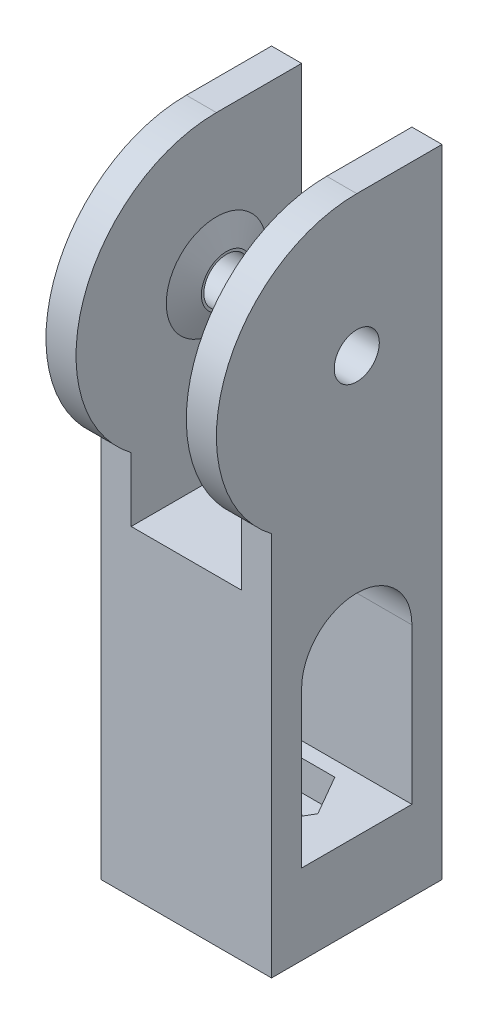
ISO-10303-21;
HEADER;
FILE_DESCRIPTION(('STEP AP214'),'2;1');
FILE_NAME('part.step','',(''),(''),'','','');
FILE_SCHEMA(('AUTOMOTIVE_DESIGN { 1 0 10303 214 1 1 1 1 }'));
ENDSEC;
DATA;
#1=APPLICATION_CONTEXT('core data for automotive mechanical design processes');
#2=APPLICATION_PROTOCOL_DEFINITION('international standard','automotive_design',2000,#1);
#3=PRODUCT_CONTEXT('',#1,'mechanical');
#4=PRODUCT('Part','Part','',(#3));
#5=PRODUCT_RELATED_PRODUCT_CATEGORY('part','',(#4));
#6=PRODUCT_DEFINITION_FORMATION('','',#4);
#7=PRODUCT_DEFINITION_CONTEXT('part definition',#1,'design');
#8=PRODUCT_DEFINITION('design','',#6,#7);
#9=PRODUCT_DEFINITION_SHAPE('','',#8);
#10=(LENGTH_UNIT() NAMED_UNIT(*) SI_UNIT(.MILLI.,.METRE.));
#11=(NAMED_UNIT(*) PLANE_ANGLE_UNIT() SI_UNIT($,.RADIAN.));
#12=(NAMED_UNIT(*) SI_UNIT($,.STERADIAN.) SOLID_ANGLE_UNIT());
#13=UNCERTAINTY_MEASURE_WITH_UNIT(LENGTH_MEASURE(1.E-05),#10,'distance_accuracy_value','');
#14=(GEOMETRIC_REPRESENTATION_CONTEXT(3) GLOBAL_UNCERTAINTY_ASSIGNED_CONTEXT((#13)) GLOBAL_UNIT_ASSIGNED_CONTEXT((#10,
#11,#12)) REPRESENTATION_CONTEXT('',''));
#15=CARTESIAN_POINT('',(0.,0.,0.));
#16=DIRECTION('',(0.,0.,1.));
#17=DIRECTION('',(1.,0.,0.));
#18=AXIS2_PLACEMENT_3D('',#15,#16,#17);
#19=CARTESIAN_POINT('',(8.5,14.5053823869162,8.5));
#20=DIRECTION('',(0.,-1.,0.));
#21=DIRECTION('',(0.,0.,-1.));
#22=AXIS2_PLACEMENT_3D('',#19,#20,#21);
#23=CYLINDRICAL_SURFACE('',#22,2.3);
#24=CARTESIAN_POINT('',(8.5,0.,8.5));
#25=DIRECTION('',(0.,-1.,0.));
#26=DIRECTION('',(0.,0.,-1.));
#27=AXIS2_PLACEMENT_3D('',#24,#25,#26);
#28=CIRCLE('',#27,2.3);
#29=CARTESIAN_POINT('',(8.5,0.,6.2));
#30=VERTEX_POINT('',#29);
#31=EDGE_CURVE('E259',#30,#30,#28,.T.);
#32=ORIENTED_EDGE('',*,*,#31,.T.);
#33=EDGE_LOOP('',(#32));
#34=FACE_BOUND('',#33,.T.);
#35=CARTESIAN_POINT('',(8.5,5.,8.5));
#36=DIRECTION('',(0.,1.,0.));
#37=DIRECTION('',(-1.,0.,0.));
#38=AXIS2_PLACEMENT_3D('',#35,#36,#37);
#39=CIRCLE('',#38,2.3);
#40=CARTESIAN_POINT('',(6.2,5.,8.5));
#41=VERTEX_POINT('',#40);
#42=EDGE_CURVE('E251',#41,#41,#39,.F.);
#43=ORIENTED_EDGE('',*,*,#42,.F.);
#44=EDGE_LOOP('',(#43));
#45=FACE_BOUND('',#44,.T.);
#46=ADVANCED_FACE('F60',(#34,#45),#23,.F.);
#47=CARTESIAN_POINT('',(0.,0.,22.5));
#48=DIRECTION('',(1.,0.,0.));
#49=DIRECTION('',(0.,0.,-1.));
#50=AXIS2_PLACEMENT_3D('',#47,#48,#49);
#51=PLANE('',#50);
#52=CARTESIAN_POINT('',(0.,49.5,8.5));
#53=DIRECTION('',(1.,0.,0.));
#54=DIRECTION('',(0.,0.,-1.));
#55=AXIS2_PLACEMENT_3D('',#52,#53,#54);
#56=CIRCLE('',#55,2.25);
#57=CARTESIAN_POINT('',(0.,49.5,6.25000000000001));
#58=VERTEX_POINT('',#57);
#59=EDGE_CURVE('E773',#58,#58,#56,.T.);
#60=ORIENTED_EDGE('',*,*,#59,.T.);
#61=EDGE_LOOP('',(#60));
#62=FACE_BOUND('',#61,.T.);
#63=CARTESIAN_POINT('',(0.,49.5,8.5));
#64=DIRECTION('',(1.,0.,0.));
#65=DIRECTION('',(0.,0.,-1.));
#66=AXIS2_PLACEMENT_3D('',#63,#64,#65);
#67=CIRCLE('',#66,14.);
#68=CARTESIAN_POINT('',(0.,63.5,8.5));
#69=VERTEX_POINT('',#68);
#70=CARTESIAN_POINT('',(0.,38.3757022693565,17.));
#71=VERTEX_POINT('',#70);
#72=EDGE_CURVE('E297',#69,#71,#67,.T.);
#73=ORIENTED_EDGE('',*,*,#72,.F.);
#74=DIRECTION('',(0.,0.,-1.));
#75=VECTOR('',#74,1.);
#76=CARTESIAN_POINT('',(0.,63.5,22.5));
#77=LINE('',#76,#75);
#78=CARTESIAN_POINT('',(0.,63.5,0.));
#79=VERTEX_POINT('',#78);
#80=EDGE_CURVE('E344',#69,#79,#77,.T.);
#81=ORIENTED_EDGE('',*,*,#80,.T.);
#82=DIRECTION('',(0.,-1.,0.));
#83=VECTOR('',#82,1.);
#84=CARTESIAN_POINT('',(0.,0.,0.));
#85=LINE('',#84,#83);
#86=CARTESIAN_POINT('',(0.,0.,0.));
#87=VERTEX_POINT('',#86);
#88=EDGE_CURVE('E320',#79,#87,#85,.T.);
#89=ORIENTED_EDGE('',*,*,#88,.T.);
#90=DIRECTION('',(0.,0.,-1.));
#91=VECTOR('',#90,1.);
#92=CARTESIAN_POINT('',(0.,0.,22.5));
#93=LINE('',#92,#91);
#94=CARTESIAN_POINT('',(0.,0.,17.));
#95=VERTEX_POINT('',#94);
#96=EDGE_CURVE('E69',#95,#87,#93,.T.);
#97=ORIENTED_EDGE('',*,*,#96,.F.);
#98=DIRECTION('',(0.,-1.,0.));
#99=VECTOR('',#98,1.);
#100=CARTESIAN_POINT('',(0.,0.,17.));
#101=LINE('',#100,#99);
#102=EDGE_CURVE('E299',#71,#95,#101,.T.);
#103=ORIENTED_EDGE('',*,*,#102,.F.);
#104=EDGE_LOOP('',(#73,#81,#89,#97,#103));
#105=FACE_BOUND('',#104,.T.);
#106=CARTESIAN_POINT('',(0.,23.5,8.5));
#107=DIRECTION('',(1.,0.,0.));
#108=DIRECTION('',(0.,0.,-1.));
#109=AXIS2_PLACEMENT_3D('',#106,#107,#108);
#110=CIRCLE('',#109,5.5);
#111=CARTESIAN_POINT('',(0.,23.5,14.));
#112=VERTEX_POINT('',#111);
#113=CARTESIAN_POINT('',(0.,23.5,3.));
#114=VERTEX_POINT('',#113);
#115=EDGE_CURVE('E269',#112,#114,#110,.F.);
#116=ORIENTED_EDGE('',*,*,#115,.F.);
#117=DIRECTION('',(0.,-1.,0.));
#118=VECTOR('',#117,1.);
#119=CARTESIAN_POINT('',(0.,0.,14.));
#120=LINE('',#119,#118);
#121=CARTESIAN_POINT('',(0.,8.,14.));
#122=VERTEX_POINT('',#121);
#123=EDGE_CURVE('E270',#112,#122,#120,.T.);
#124=ORIENTED_EDGE('',*,*,#123,.T.);
#125=DIRECTION('',(0.,0.,-1.));
#126=VECTOR('',#125,1.);
#127=CARTESIAN_POINT('',(0.,8.,0.));
#128=LINE('',#127,#126);
#129=CARTESIAN_POINT('',(0.,8.,3.));
#130=VERTEX_POINT('',#129);
#131=EDGE_CURVE('E85',#122,#130,#128,.T.);
#132=ORIENTED_EDGE('',*,*,#131,.T.);
#133=DIRECTION('',(0.,-1.,0.));
#134=VECTOR('',#133,1.);
#135=CARTESIAN_POINT('',(0.,0.,3.));
#136=LINE('',#135,#134);
#137=EDGE_CURVE('E285',#114,#130,#136,.T.);
#138=ORIENTED_EDGE('',*,*,#137,.F.);
#139=EDGE_LOOP('',(#116,#124,#132,#138));
#140=FACE_BOUND('',#139,.T.);
#141=ADVANCED_FACE('F62',(#62,#105,#140),#51,.F.);
#142=CARTESIAN_POINT('',(17.,0.,22.5));
#143=DIRECTION('',(-1.,0.,0.));
#144=DIRECTION('',(0.,0.,1.));
#145=AXIS2_PLACEMENT_3D('',#142,#143,#144);
#146=PLANE('',#145);
#147=CARTESIAN_POINT('',(17.,49.5,8.5));
#148=DIRECTION('',(1.,0.,0.));
#149=DIRECTION('',(0.,0.,-1.));
#150=AXIS2_PLACEMENT_3D('',#147,#148,#149);
#151=CIRCLE('',#150,2.25);
#152=CARTESIAN_POINT('',(17.,49.5,6.25));
#153=VERTEX_POINT('',#152);
#154=EDGE_CURVE('E777',#153,#153,#151,.T.);
#155=ORIENTED_EDGE('',*,*,#154,.F.);
#156=EDGE_LOOP('',(#155));
#157=FACE_BOUND('',#156,.T.);
#158=DIRECTION('',(0.,0.,-1.));
#159=VECTOR('',#158,1.);
#160=CARTESIAN_POINT('',(17.,63.5,22.5));
#161=LINE('',#160,#159);
#162=CARTESIAN_POINT('',(17.,63.5,8.5));
#163=VERTEX_POINT('',#162);
#164=CARTESIAN_POINT('',(17.,63.5,0.));
#165=VERTEX_POINT('',#164);
#166=EDGE_CURVE('E354',#163,#165,#161,.T.);
#167=ORIENTED_EDGE('',*,*,#166,.F.);
#168=CARTESIAN_POINT('',(17.,49.5,8.5));
#169=DIRECTION('',(1.,0.,0.));
#170=DIRECTION('',(0.,0.,-1.));
#171=AXIS2_PLACEMENT_3D('',#168,#169,#170);
#172=CIRCLE('',#171,14.);
#173=CARTESIAN_POINT('',(17.,38.3757022693565,17.));
#174=VERTEX_POINT('',#173);
#175=EDGE_CURVE('E296',#163,#174,#172,.T.);
#176=ORIENTED_EDGE('',*,*,#175,.T.);
#177=DIRECTION('',(0.,-1.,0.));
#178=VECTOR('',#177,1.);
#179=CARTESIAN_POINT('',(17.,0.,17.));
#180=LINE('',#179,#178);
#181=CARTESIAN_POINT('',(17.,0.,17.));
#182=VERTEX_POINT('',#181);
#183=EDGE_CURVE('E300',#174,#182,#180,.T.);
#184=ORIENTED_EDGE('',*,*,#183,.T.);
#185=DIRECTION('',(0.,0.,-1.));
#186=VECTOR('',#185,1.);
#187=CARTESIAN_POINT('',(17.,0.,22.5));
#188=LINE('',#187,#186);
#189=CARTESIAN_POINT('',(17.,0.,0.));
#190=VERTEX_POINT('',#189);
#191=EDGE_CURVE('E356',#182,#190,#188,.T.);
#192=ORIENTED_EDGE('',*,*,#191,.T.);
#193=DIRECTION('',(0.,1.,0.));
#194=VECTOR('',#193,1.);
#195=CARTESIAN_POINT('',(17.,0.,0.));
#196=LINE('',#195,#194);
#197=EDGE_CURVE('E326',#190,#165,#196,.T.);
#198=ORIENTED_EDGE('',*,*,#197,.T.);
#199=EDGE_LOOP('',(#167,#176,#184,#192,#198));
#200=FACE_BOUND('',#199,.T.);
#201=CARTESIAN_POINT('',(17.,23.5,8.5));
#202=DIRECTION('',(1.,0.,0.));
#203=DIRECTION('',(0.,0.,-1.));
#204=AXIS2_PLACEMENT_3D('',#201,#202,#203);
#205=CIRCLE('',#204,5.5);
#206=CARTESIAN_POINT('',(17.,23.5,14.));
#207=VERTEX_POINT('',#206);
#208=CARTESIAN_POINT('',(17.,23.5,3.));
#209=VERTEX_POINT('',#208);
#210=EDGE_CURVE('E262',#207,#209,#205,.F.);
#211=ORIENTED_EDGE('',*,*,#210,.T.);
#212=DIRECTION('',(0.,-1.,0.));
#213=VECTOR('',#212,1.);
#214=CARTESIAN_POINT('',(17.,0.,3.));
#215=LINE('',#214,#213);
#216=CARTESIAN_POINT('',(17.,8.,3.));
#217=VERTEX_POINT('',#216);
#218=EDGE_CURVE('E266',#209,#217,#215,.T.);
#219=ORIENTED_EDGE('',*,*,#218,.T.);
#220=DIRECTION('',(0.,0.,-1.));
#221=VECTOR('',#220,1.);
#222=CARTESIAN_POINT('',(17.,8.,0.));
#223=LINE('',#222,#221);
#224=CARTESIAN_POINT('',(17.,8.,14.));
#225=VERTEX_POINT('',#224);
#226=EDGE_CURVE('E278',#225,#217,#223,.T.);
#227=ORIENTED_EDGE('',*,*,#226,.F.);
#228=DIRECTION('',(0.,-1.,0.));
#229=VECTOR('',#228,1.);
#230=CARTESIAN_POINT('',(17.,0.,14.));
#231=LINE('',#230,#229);
#232=EDGE_CURVE('E282',#207,#225,#231,.T.);
#233=ORIENTED_EDGE('',*,*,#232,.F.);
#234=EDGE_LOOP('',(#211,#219,#227,#233));
#235=FACE_BOUND('',#234,.T.);
#236=ADVANCED_FACE('F389',(#157,#200,#235),#146,.F.);
#237=CARTESIAN_POINT('',(14.,63.5,22.5));
#238=DIRECTION('',(1.,0.,0.));
#239=DIRECTION('',(0.,1.,0.));
#240=AXIS2_PLACEMENT_3D('',#237,#238,#239);
#241=PLANE('',#240);
#242=CARTESIAN_POINT('',(14.,49.5,8.5));
#243=DIRECTION('',(-1.,0.,0.));
#244=DIRECTION('',(0.,-1.,0.));
#245=AXIS2_PLACEMENT_3D('',#242,#243,#244);
#246=CIRCLE('',#245,5.);
#247=CARTESIAN_POINT('',(14.,44.5,8.5));
#248=VERTEX_POINT('',#247);
#249=EDGE_CURVE('E740',#248,#248,#246,.T.);
#250=ORIENTED_EDGE('',*,*,#249,.F.);
#251=EDGE_LOOP('',(#250));
#252=FACE_BOUND('',#251,.T.);
#253=CARTESIAN_POINT('',(14.,49.5,8.5));
#254=DIRECTION('',(1.,0.,0.));
#255=DIRECTION('',(0.,1.,0.));
#256=AXIS2_PLACEMENT_3D('',#253,#254,#255);
#257=CIRCLE('',#256,14.);
#258=CARTESIAN_POINT('',(14.,63.5,8.5));
#259=VERTEX_POINT('',#258);
#260=CARTESIAN_POINT('',(14.,38.3757022693565,17.));
#261=VERTEX_POINT('',#260);
#262=EDGE_CURVE('E314',#259,#261,#257,.T.);
#263=ORIENTED_EDGE('',*,*,#262,.F.);
#264=DIRECTION('',(0.,0.,-1.));
#265=VECTOR('',#264,1.);
#266=CARTESIAN_POINT('',(14.,63.5,22.5));
#267=LINE('',#266,#265);
#268=CARTESIAN_POINT('',(14.,63.5,0.));
#269=VERTEX_POINT('',#268);
#270=EDGE_CURVE('E352',#259,#269,#267,.T.);
#271=ORIENTED_EDGE('',*,*,#270,.T.);
#272=DIRECTION('',(0.,-1.,0.));
#273=VECTOR('',#272,1.);
#274=CARTESIAN_POINT('',(14.,63.5,0.));
#275=LINE('',#274,#273);
#276=CARTESIAN_POINT('',(14.,32.,0.));
#277=VERTEX_POINT('',#276);
#278=EDGE_CURVE('E332',#269,#277,#275,.T.);
#279=ORIENTED_EDGE('',*,*,#278,.T.);
#280=DIRECTION('',(0.,0.,-1.));
#281=VECTOR('',#280,1.);
#282=CARTESIAN_POINT('',(14.,32.,22.5));
#283=LINE('',#282,#281);
#284=CARTESIAN_POINT('',(14.,32.,17.));
#285=VERTEX_POINT('',#284);
#286=EDGE_CURVE('E350',#285,#277,#283,.T.);
#287=ORIENTED_EDGE('',*,*,#286,.F.);
#288=DIRECTION('',(0.,-1.,0.));
#289=VECTOR('',#288,1.);
#290=CARTESIAN_POINT('',(14.,63.5,17.));
#291=LINE('',#290,#289);
#292=EDGE_CURVE('E318',#261,#285,#291,.T.);
#293=ORIENTED_EDGE('',*,*,#292,.F.);
#294=EDGE_LOOP('',(#263,#271,#279,#287,#293));
#295=FACE_BOUND('',#294,.T.);
#296=ADVANCED_FACE('F379',(#252,#295),#241,.F.);
#297=CARTESIAN_POINT('',(2.99999999999999,63.5,22.5));
#298=DIRECTION('',(-1.,0.,0.));
#299=DIRECTION('',(0.,-1.,0.));
#300=AXIS2_PLACEMENT_3D('',#297,#298,#299);
#301=PLANE('',#300);
#302=CARTESIAN_POINT('',(3.,49.5,8.5));
#303=DIRECTION('',(-1.,0.,0.));
#304=DIRECTION('',(0.,-1.,0.));
#305=AXIS2_PLACEMENT_3D('',#302,#303,#304);
#306=CIRCLE('',#305,5.);
#307=CARTESIAN_POINT('',(3.,44.5,8.5));
#308=VERTEX_POINT('',#307);
#309=EDGE_CURVE('E364',#308,#308,#306,.T.);
#310=ORIENTED_EDGE('',*,*,#309,.T.);
#311=EDGE_LOOP('',(#310));
#312=FACE_BOUND('',#311,.T.);
#313=DIRECTION('',(0.,0.,-1.));
#314=VECTOR('',#313,1.);
#315=CARTESIAN_POINT('',(2.99999999999999,63.5,22.5));
#316=LINE('',#315,#314);
#317=CARTESIAN_POINT('',(2.99999999999999,63.5,8.5));
#318=VERTEX_POINT('',#317);
#319=CARTESIAN_POINT('',(2.99999999999999,63.5,0.));
#320=VERTEX_POINT('',#319);
#321=EDGE_CURVE('E346',#318,#320,#316,.T.);
#322=ORIENTED_EDGE('',*,*,#321,.F.);
#323=CARTESIAN_POINT('',(3.,49.5,8.5));
#324=DIRECTION('',(-1.,0.,0.));
#325=DIRECTION('',(0.,-1.,0.));
#326=AXIS2_PLACEMENT_3D('',#323,#324,#325);
#327=CIRCLE('',#326,14.);
#328=CARTESIAN_POINT('',(3.,38.3757022693565,17.));
#329=VERTEX_POINT('',#328);
#330=EDGE_CURVE('E310',#329,#318,#327,.T.);
#331=ORIENTED_EDGE('',*,*,#330,.F.);
#332=DIRECTION('',(0.,1.,0.));
#333=VECTOR('',#332,1.);
#334=CARTESIAN_POINT('',(2.99999999999999,63.5,17.));
#335=LINE('',#334,#333);
#336=CARTESIAN_POINT('',(3.,32.,17.));
#337=VERTEX_POINT('',#336);
#338=EDGE_CURVE('E12',#337,#329,#335,.T.);
#339=ORIENTED_EDGE('',*,*,#338,.F.);
#340=DIRECTION('',(0.,0.,-1.));
#341=VECTOR('',#340,1.);
#342=CARTESIAN_POINT('',(3.,32.,22.5));
#343=LINE('',#342,#341);
#344=CARTESIAN_POINT('',(3.,32.,0.));
#345=VERTEX_POINT('',#344);
#346=EDGE_CURVE('E348',#337,#345,#343,.T.);
#347=ORIENTED_EDGE('',*,*,#346,.T.);
#348=DIRECTION('',(0.,1.,0.));
#349=VECTOR('',#348,1.);
#350=CARTESIAN_POINT('',(2.99999999999999,63.5,0.));
#351=LINE('',#350,#349);
#352=EDGE_CURVE('E338',#345,#320,#351,.T.);
#353=ORIENTED_EDGE('',*,*,#352,.T.);
#354=EDGE_LOOP('',(#322,#331,#339,#347,#353));
#355=FACE_BOUND('',#354,.T.);
#356=ADVANCED_FACE('F368',(#312,#355),#301,.F.);
#357=CARTESIAN_POINT('',(0.,0.,22.5));
#358=DIRECTION('',(0.,1.,0.));
#359=DIRECTION('',(0.,0.,1.));
#360=AXIS2_PLACEMENT_3D('',#357,#358,#359);
#361=PLANE('',#360);
#362=ORIENTED_EDGE('',*,*,#31,.F.);
#363=EDGE_LOOP('',(#362));
#364=FACE_BOUND('',#363,.T.);
#365=DIRECTION('',(1.,0.,0.));
#366=VECTOR('',#365,1.);
#367=CARTESIAN_POINT('',(0.,0.,17.));
#368=LINE('',#367,#366);
#369=EDGE_CURVE('E302',#95,#182,#368,.T.);
#370=ORIENTED_EDGE('',*,*,#369,.F.);
#371=ORIENTED_EDGE('',*,*,#96,.T.);
#372=DIRECTION('',(1.,0.,0.));
#373=VECTOR('',#372,1.);
#374=CARTESIAN_POINT('',(0.,0.,0.));
#375=LINE('',#374,#373);
#376=EDGE_CURVE('E323',#87,#190,#375,.T.);
#377=ORIENTED_EDGE('',*,*,#376,.T.);
#378=ORIENTED_EDGE('',*,*,#191,.F.);
#379=EDGE_LOOP('',(#370,#371,#377,#378));
#380=FACE_BOUND('',#379,.T.);
#381=ADVANCED_FACE('F378',(#364,#380),#361,.F.);
#382=CARTESIAN_POINT('',(3.,32.,22.5));
#383=DIRECTION('',(0.,-1.,0.));
#384=DIRECTION('',(0.,0.,-1.));
#385=AXIS2_PLACEMENT_3D('',#382,#383,#384);
#386=PLANE('',#385);
#387=DIRECTION('',(-1.,0.,0.));
#388=VECTOR('',#387,1.);
#389=CARTESIAN_POINT('',(3.,32.,17.));
#390=LINE('',#389,#388);
#391=EDGE_CURVE('E316',#285,#337,#390,.T.);
#392=ORIENTED_EDGE('',*,*,#391,.F.);
#393=ORIENTED_EDGE('',*,*,#286,.T.);
#394=DIRECTION('',(-1.,0.,0.));
#395=VECTOR('',#394,1.);
#396=CARTESIAN_POINT('',(3.,32.,0.));
#397=LINE('',#396,#395);
#398=EDGE_CURVE('E335',#277,#345,#397,.T.);
#399=ORIENTED_EDGE('',*,*,#398,.T.);
#400=ORIENTED_EDGE('',*,*,#346,.F.);
#401=EDGE_LOOP('',(#392,#393,#399,#400));
#402=FACE_BOUND('',#401,.T.);
#403=ADVANCED_FACE('F382',(#402),#386,.F.);
#404=CARTESIAN_POINT('',(14.,63.5,22.5));
#405=DIRECTION('',(0.,-1.,0.));
#406=DIRECTION('',(0.,0.,-1.));
#407=AXIS2_PLACEMENT_3D('',#404,#405,#406);
#408=PLANE('',#407);
#409=ORIENTED_EDGE('',*,*,#270,.F.);
#410=DIRECTION('',(1.,0.,0.));
#411=VECTOR('',#410,1.);
#412=CARTESIAN_POINT('',(0.,63.5,8.5));
#413=LINE('',#412,#411);
#414=EDGE_CURVE('E281',#259,#163,#413,.T.);
#415=ORIENTED_EDGE('',*,*,#414,.T.);
#416=ORIENTED_EDGE('',*,*,#166,.T.);
#417=DIRECTION('',(-1.,0.,0.));
#418=VECTOR('',#417,1.);
#419=CARTESIAN_POINT('',(14.,63.5,0.));
#420=LINE('',#419,#418);
#421=EDGE_CURVE('E329',#165,#269,#420,.T.);
#422=ORIENTED_EDGE('',*,*,#421,.T.);
#423=EDGE_LOOP('',(#409,#415,#416,#422));
#424=FACE_BOUND('',#423,.T.);
#425=ADVANCED_FACE('F385',(#424),#408,.F.);
#426=CARTESIAN_POINT('',(0.,63.5,22.5));
#427=DIRECTION('',(0.,-1.,0.));
#428=DIRECTION('',(0.,0.,-1.));
#429=AXIS2_PLACEMENT_3D('',#426,#427,#428);
#430=PLANE('',#429);
#431=ORIENTED_EDGE('',*,*,#80,.F.);
#432=EDGE_CURVE('E293',#69,#318,#413,.T.);
#433=ORIENTED_EDGE('',*,*,#432,.T.);
#434=ORIENTED_EDGE('',*,*,#321,.T.);
#435=DIRECTION('',(-1.,0.,0.));
#436=VECTOR('',#435,1.);
#437=CARTESIAN_POINT('',(0.,63.5,0.));
#438=LINE('',#437,#436);
#439=EDGE_CURVE('E341',#320,#79,#438,.T.);
#440=ORIENTED_EDGE('',*,*,#439,.T.);
#441=EDGE_LOOP('',(#431,#433,#434,#440));
#442=FACE_BOUND('',#441,.T.);
#443=ADVANCED_FACE('F380',(#442),#430,.F.);
#444=CARTESIAN_POINT('',(0.,0.,0.));
#445=DIRECTION('',(0.,0.,-1.));
#446=DIRECTION('',(-1.,0.,0.));
#447=AXIS2_PLACEMENT_3D('',#444,#445,#446);
#448=PLANE('',#447);
#449=ORIENTED_EDGE('',*,*,#88,.F.);
#450=ORIENTED_EDGE('',*,*,#439,.F.);
#451=ORIENTED_EDGE('',*,*,#352,.F.);
#452=ORIENTED_EDGE('',*,*,#398,.F.);
#453=ORIENTED_EDGE('',*,*,#278,.F.);
#454=ORIENTED_EDGE('',*,*,#421,.F.);
#455=ORIENTED_EDGE('',*,*,#197,.F.);
#456=ORIENTED_EDGE('',*,*,#376,.F.);
#457=EDGE_LOOP('',(#449,#450,#451,#452,#453,#454,#455,#456));
#458=FACE_BOUND('',#457,.T.);
#459=ADVANCED_FACE('F434',(#458),#448,.T.);
#460=CARTESIAN_POINT('',(0.,0.,17.));
#461=DIRECTION('',(0.,0.,1.));
#462=DIRECTION('',(0.,-1.,0.));
#463=AXIS2_PLACEMENT_3D('',#460,#461,#462);
#464=PLANE('',#463);
#465=ORIENTED_EDGE('',*,*,#292,.T.);
#466=ORIENTED_EDGE('',*,*,#391,.T.);
#467=ORIENTED_EDGE('',*,*,#338,.T.);
#468=DIRECTION('',(1.,0.,0.));
#469=VECTOR('',#468,1.);
#470=CARTESIAN_POINT('',(0.,38.3757022693565,17.));
#471=LINE('',#470,#469);
#472=EDGE_CURVE('E307',#71,#329,#471,.T.);
#473=ORIENTED_EDGE('',*,*,#472,.F.);
#474=ORIENTED_EDGE('',*,*,#102,.T.);
#475=ORIENTED_EDGE('',*,*,#369,.T.);
#476=ORIENTED_EDGE('',*,*,#183,.F.);
#477=EDGE_CURVE('E311',#261,#174,#471,.T.);
#478=ORIENTED_EDGE('',*,*,#477,.F.);
#479=EDGE_LOOP('',(#465,#466,#467,#473,#474,#475,#476,#478));
#480=FACE_BOUND('',#479,.T.);
#481=ADVANCED_FACE('F430',(#480),#464,.T.);
#482=CARTESIAN_POINT('',(0.,49.5,8.5));
#483=DIRECTION('',(1.,0.,0.));
#484=DIRECTION('',(0.,0.,-1.));
#485=AXIS2_PLACEMENT_3D('',#482,#483,#484);
#486=CYLINDRICAL_SURFACE('',#485,14.);
#487=ORIENTED_EDGE('',*,*,#262,.T.);
#488=ORIENTED_EDGE('',*,*,#477,.T.);
#489=ORIENTED_EDGE('',*,*,#175,.F.);
#490=ORIENTED_EDGE('',*,*,#414,.F.);
#491=EDGE_LOOP('',(#487,#488,#489,#490));
#492=FACE_BOUND('',#491,.T.);
#493=ADVANCED_FACE('F433',(#492),#486,.T.);
#494=ORIENTED_EDGE('',*,*,#330,.T.);
#495=ORIENTED_EDGE('',*,*,#432,.F.);
#496=ORIENTED_EDGE('',*,*,#72,.T.);
#497=ORIENTED_EDGE('',*,*,#472,.T.);
#498=EDGE_LOOP('',(#494,#495,#496,#497));
#499=FACE_BOUND('',#498,.T.);
#500=ADVANCED_FACE('F417',(#499),#486,.T.);
#501=CARTESIAN_POINT('',(0.,23.5,8.5));
#502=DIRECTION('',(1.,0.,0.));
#503=DIRECTION('',(0.,0.,-1.));
#504=AXIS2_PLACEMENT_3D('',#501,#502,#503);
#505=CYLINDRICAL_SURFACE('',#504,5.5);
#506=ORIENTED_EDGE('',*,*,#210,.F.);
#507=DIRECTION('',(1.,0.,0.));
#508=VECTOR('',#507,1.);
#509=CARTESIAN_POINT('',(0.,23.5,14.));
#510=LINE('',#509,#508);
#511=EDGE_CURVE('E263',#112,#207,#510,.T.);
#512=ORIENTED_EDGE('',*,*,#511,.F.);
#513=ORIENTED_EDGE('',*,*,#115,.T.);
#514=DIRECTION('',(1.,0.,0.));
#515=VECTOR('',#514,1.);
#516=CARTESIAN_POINT('',(0.,23.5,3.));
#517=LINE('',#516,#515);
#518=EDGE_CURVE('E273',#114,#209,#517,.T.);
#519=ORIENTED_EDGE('',*,*,#518,.T.);
#520=EDGE_LOOP('',(#506,#512,#513,#519));
#521=FACE_BOUND('',#520,.T.);
#522=ADVANCED_FACE('F413',(#521),#505,.F.);
#523=CARTESIAN_POINT('',(0.,0.,3.));
#524=DIRECTION('',(0.,0.,1.));
#525=DIRECTION('',(0.,-1.,0.));
#526=AXIS2_PLACEMENT_3D('',#523,#524,#525);
#527=PLANE('',#526);
#528=ORIENTED_EDGE('',*,*,#218,.F.);
#529=ORIENTED_EDGE('',*,*,#518,.F.);
#530=ORIENTED_EDGE('',*,*,#137,.T.);
#531=DIRECTION('',(1.,0.,0.));
#532=VECTOR('',#531,1.);
#533=CARTESIAN_POINT('',(0.,8.,3.));
#534=LINE('',#533,#532);
#535=EDGE_CURVE('E271',#130,#217,#534,.T.);
#536=ORIENTED_EDGE('',*,*,#535,.T.);
#537=EDGE_LOOP('',(#528,#529,#530,#536));
#538=FACE_BOUND('',#537,.T.);
#539=ADVANCED_FACE('F416',(#538),#527,.T.);
#540=CARTESIAN_POINT('',(0.,8.,0.));
#541=DIRECTION('',(0.,-1.,0.));
#542=DIRECTION('',(0.,0.,-1.));
#543=AXIS2_PLACEMENT_3D('',#540,#541,#542);
#544=PLANE('',#543);
#545=DIRECTION('',(0.5,0.,0.866025403784439));
#546=VECTOR('',#545,1.);
#547=CARTESIAN_POINT('',(3.881197846483,8.,8.50000000000001));
#548=LINE('',#547,#546);
#549=CARTESIAN_POINT('',(3.881197846483,8.,8.50000000000001));
#550=VERTEX_POINT('',#549);
#551=CARTESIAN_POINT('',(6.1905989232415,8.,12.5));
#552=VERTEX_POINT('',#551);
#553=EDGE_CURVE('E238',#550,#552,#548,.T.);
#554=ORIENTED_EDGE('',*,*,#553,.F.);
#555=DIRECTION('',(-0.499999999999999,0.,0.866025403784439));
#556=VECTOR('',#555,1.);
#557=CARTESIAN_POINT('',(6.1905989232415,8.,4.5));
#558=LINE('',#557,#556);
#559=CARTESIAN_POINT('',(6.1905989232415,8.,4.5));
#560=VERTEX_POINT('',#559);
#561=EDGE_CURVE('E77',#560,#550,#558,.T.);
#562=ORIENTED_EDGE('',*,*,#561,.F.);
#563=DIRECTION('',(-1.,0.,0.));
#564=VECTOR('',#563,1.);
#565=CARTESIAN_POINT('',(10.8094010767585,8.,4.5));
#566=LINE('',#565,#564);
#567=CARTESIAN_POINT('',(10.8094010767585,8.,4.5));
#568=VERTEX_POINT('',#567);
#569=EDGE_CURVE('E221',#568,#560,#566,.T.);
#570=ORIENTED_EDGE('',*,*,#569,.F.);
#571=DIRECTION('',(-0.5,0.,-0.866025403784439));
#572=VECTOR('',#571,1.);
#573=CARTESIAN_POINT('',(13.118802153517,8.,8.5));
#574=LINE('',#573,#572);
#575=CARTESIAN_POINT('',(13.118802153517,8.,8.5));
#576=VERTEX_POINT('',#575);
#577=EDGE_CURVE('E224',#576,#568,#574,.T.);
#578=ORIENTED_EDGE('',*,*,#577,.F.);
#579=DIRECTION('',(0.5,0.,-0.866025403784439));
#580=VECTOR('',#579,1.);
#581=CARTESIAN_POINT('',(10.8094010767585,8.,12.5));
#582=LINE('',#581,#580);
#583=CARTESIAN_POINT('',(10.8094010767585,8.,12.5));
#584=VERTEX_POINT('',#583);
#585=EDGE_CURVE('E244',#584,#576,#582,.T.);
#586=ORIENTED_EDGE('',*,*,#585,.F.);
#587=DIRECTION('',(1.,0.,0.));
#588=VECTOR('',#587,1.);
#589=CARTESIAN_POINT('',(6.1905989232415,8.,12.5));
#590=LINE('',#589,#588);
#591=EDGE_CURVE('E241',#552,#584,#590,.T.);
#592=ORIENTED_EDGE('',*,*,#591,.F.);
#593=EDGE_LOOP('',(#554,#562,#570,#578,#586,#592));
#594=FACE_BOUND('',#593,.T.);
#595=ORIENTED_EDGE('',*,*,#226,.T.);
#596=ORIENTED_EDGE('',*,*,#535,.F.);
#597=ORIENTED_EDGE('',*,*,#131,.F.);
#598=DIRECTION('',(1.,0.,0.));
#599=VECTOR('',#598,1.);
#600=CARTESIAN_POINT('',(0.,8.,14.));
#601=LINE('',#600,#599);
#602=EDGE_CURVE('E267',#122,#225,#601,.T.);
#603=ORIENTED_EDGE('',*,*,#602,.T.);
#604=EDGE_LOOP('',(#595,#596,#597,#603));
#605=FACE_BOUND('',#604,.T.);
#606=ADVANCED_FACE('F422',(#594,#605),#544,.F.);
#607=CARTESIAN_POINT('',(0.,0.,14.));
#608=DIRECTION('',(0.,0.,1.));
#609=DIRECTION('',(1.,0.,0.));
#610=AXIS2_PLACEMENT_3D('',#607,#608,#609);
#611=PLANE('',#610);
#612=ORIENTED_EDGE('',*,*,#232,.T.);
#613=ORIENTED_EDGE('',*,*,#602,.F.);
#614=ORIENTED_EDGE('',*,*,#123,.F.);
#615=ORIENTED_EDGE('',*,*,#511,.T.);
#616=EDGE_LOOP('',(#612,#613,#614,#615));
#617=FACE_BOUND('',#616,.T.);
#618=ADVANCED_FACE('F419',(#617),#611,.F.);
#619=CARTESIAN_POINT('',(0.,5.,0.));
#620=DIRECTION('',(0.,1.,0.));
#621=DIRECTION('',(-1.,0.,0.));
#622=AXIS2_PLACEMENT_3D('',#619,#620,#621);
#623=PLANE('',#622);
#624=DIRECTION('',(-0.499999999999999,0.,0.866025403784439));
#625=VECTOR('',#624,1.);
#626=CARTESIAN_POINT('',(6.1905989232415,5.,4.5));
#627=LINE('',#626,#625);
#628=CARTESIAN_POINT('',(6.1905989232415,5.,4.5));
#629=VERTEX_POINT('',#628);
#630=CARTESIAN_POINT('',(3.881197846483,5.,8.50000000000001));
#631=VERTEX_POINT('',#630);
#632=EDGE_CURVE('E201',#629,#631,#627,.T.);
#633=ORIENTED_EDGE('',*,*,#632,.T.);
#634=DIRECTION('',(0.5,0.,0.866025403784439));
#635=VECTOR('',#634,1.);
#636=CARTESIAN_POINT('',(3.881197846483,5.,8.50000000000001));
#637=LINE('',#636,#635);
#638=CARTESIAN_POINT('',(6.1905989232415,5.,12.5));
#639=VERTEX_POINT('',#638);
#640=EDGE_CURVE('E210',#631,#639,#637,.T.);
#641=ORIENTED_EDGE('',*,*,#640,.T.);
#642=DIRECTION('',(1.,0.,0.));
#643=VECTOR('',#642,1.);
#644=CARTESIAN_POINT('',(6.1905989232415,5.,12.5));
#645=LINE('',#644,#643);
#646=CARTESIAN_POINT('',(10.8094010767585,5.,12.5));
#647=VERTEX_POINT('',#646);
#648=EDGE_CURVE('E215',#639,#647,#645,.T.);
#649=ORIENTED_EDGE('',*,*,#648,.T.);
#650=DIRECTION('',(0.5,0.,-0.866025403784439));
#651=VECTOR('',#650,1.);
#652=CARTESIAN_POINT('',(10.8094010767585,5.,12.5));
#653=LINE('',#652,#651);
#654=CARTESIAN_POINT('',(13.118802153517,5.,8.5));
#655=VERTEX_POINT('',#654);
#656=EDGE_CURVE('E231',#647,#655,#653,.T.);
#657=ORIENTED_EDGE('',*,*,#656,.T.);
#658=DIRECTION('',(-0.5,0.,-0.866025403784439));
#659=VECTOR('',#658,1.);
#660=CARTESIAN_POINT('',(13.118802153517,5.,8.5));
#661=LINE('',#660,#659);
#662=CARTESIAN_POINT('',(10.8094010767585,5.,4.5));
#663=VERTEX_POINT('',#662);
#664=EDGE_CURVE('E234',#655,#663,#661,.T.);
#665=ORIENTED_EDGE('',*,*,#664,.T.);
#666=DIRECTION('',(-1.,0.,0.));
#667=VECTOR('',#666,1.);
#668=CARTESIAN_POINT('',(10.8094010767585,5.,4.5));
#669=LINE('',#668,#667);
#670=EDGE_CURVE('E207',#663,#629,#669,.T.);
#671=ORIENTED_EDGE('',*,*,#670,.T.);
#672=EDGE_LOOP('',(#633,#641,#649,#657,#665,#671));
#673=FACE_BOUND('',#672,.T.);
#674=ORIENTED_EDGE('',*,*,#42,.T.);
#675=EDGE_LOOP('',(#674));
#676=FACE_BOUND('',#675,.T.);
#677=ADVANCED_FACE('F217',(#673,#676),#623,.T.);
#678=CARTESIAN_POINT('',(6.1905989232415,5.,4.5));
#679=DIRECTION('',(-0.866025403784439,0.,-0.499999999999999));
#680=DIRECTION('',(-0.499999999999999,0.,0.866025403784439));
#681=AXIS2_PLACEMENT_3D('',#678,#679,#680);
#682=PLANE('',#681);
#683=ORIENTED_EDGE('',*,*,#561,.T.);
#684=DIRECTION('',(0.,1.,0.));
#685=VECTOR('',#684,1.);
#686=CARTESIAN_POINT('',(3.881197846483,5.,8.50000000000001));
#687=LINE('',#686,#685);
#688=EDGE_CURVE('E197',#631,#550,#687,.T.);
#689=ORIENTED_EDGE('',*,*,#688,.F.);
#690=ORIENTED_EDGE('',*,*,#632,.F.);
#691=DIRECTION('',(0.,1.,0.));
#692=VECTOR('',#691,1.);
#693=CARTESIAN_POINT('',(6.1905989232415,5.,4.5));
#694=LINE('',#693,#692);
#695=EDGE_CURVE('E249',#629,#560,#694,.T.);
#696=ORIENTED_EDGE('',*,*,#695,.T.);
#697=EDGE_LOOP('',(#683,#689,#690,#696));
#698=FACE_BOUND('',#697,.T.);
#699=ADVANCED_FACE('F199',(#698),#682,.F.);
#700=CARTESIAN_POINT('',(10.8094010767585,5.,4.5));
#701=DIRECTION('',(0.,0.,-1.));
#702=DIRECTION('',(0.,1.,0.));
#703=AXIS2_PLACEMENT_3D('',#700,#701,#702);
#704=PLANE('',#703);
#705=ORIENTED_EDGE('',*,*,#569,.T.);
#706=ORIENTED_EDGE('',*,*,#695,.F.);
#707=ORIENTED_EDGE('',*,*,#670,.F.);
#708=DIRECTION('',(0.,1.,0.));
#709=VECTOR('',#708,1.);
#710=CARTESIAN_POINT('',(10.8094010767585,5.,4.5));
#711=LINE('',#710,#709);
#712=EDGE_CURVE('E252',#663,#568,#711,.T.);
#713=ORIENTED_EDGE('',*,*,#712,.T.);
#714=EDGE_LOOP('',(#705,#706,#707,#713));
#715=FACE_BOUND('',#714,.T.);
#716=ADVANCED_FACE('F512',(#715),#704,.F.);
#717=CARTESIAN_POINT('',(13.118802153517,5.,8.5));
#718=DIRECTION('',(0.866025403784439,0.,-0.5));
#719=DIRECTION('',(-0.5,0.,-0.866025403784439));
#720=AXIS2_PLACEMENT_3D('',#717,#718,#719);
#721=PLANE('',#720);
#722=ORIENTED_EDGE('',*,*,#577,.T.);
#723=ORIENTED_EDGE('',*,*,#712,.F.);
#724=ORIENTED_EDGE('',*,*,#664,.F.);
#725=DIRECTION('',(0.,1.,0.));
#726=VECTOR('',#725,1.);
#727=CARTESIAN_POINT('',(13.118802153517,5.,8.5));
#728=LINE('',#727,#726);
#729=EDGE_CURVE('E254',#655,#576,#728,.T.);
#730=ORIENTED_EDGE('',*,*,#729,.T.);
#731=EDGE_LOOP('',(#722,#723,#724,#730));
#732=FACE_BOUND('',#731,.T.);
#733=ADVANCED_FACE('F518',(#732),#721,.F.);
#734=CARTESIAN_POINT('',(10.8094010767585,5.,12.5));
#735=DIRECTION('',(0.866025403784439,0.,0.5));
#736=DIRECTION('',(0.5,0.,-0.866025403784439));
#737=AXIS2_PLACEMENT_3D('',#734,#735,#736);
#738=PLANE('',#737);
#739=ORIENTED_EDGE('',*,*,#585,.T.);
#740=ORIENTED_EDGE('',*,*,#729,.F.);
#741=ORIENTED_EDGE('',*,*,#656,.F.);
#742=DIRECTION('',(0.,1.,0.));
#743=VECTOR('',#742,1.);
#744=CARTESIAN_POINT('',(10.8094010767585,5.,12.5));
#745=LINE('',#744,#743);
#746=EDGE_CURVE('E256',#647,#584,#745,.T.);
#747=ORIENTED_EDGE('',*,*,#746,.T.);
#748=EDGE_LOOP('',(#739,#740,#741,#747));
#749=FACE_BOUND('',#748,.T.);
#750=ADVANCED_FACE('F526',(#749),#738,.F.);
#751=CARTESIAN_POINT('',(6.1905989232415,5.,12.5));
#752=DIRECTION('',(0.,0.,1.));
#753=DIRECTION('',(1.,0.,0.));
#754=AXIS2_PLACEMENT_3D('',#751,#752,#753);
#755=PLANE('',#754);
#756=ORIENTED_EDGE('',*,*,#591,.T.);
#757=ORIENTED_EDGE('',*,*,#746,.F.);
#758=ORIENTED_EDGE('',*,*,#648,.F.);
#759=DIRECTION('',(0.,1.,0.));
#760=VECTOR('',#759,1.);
#761=CARTESIAN_POINT('',(6.1905989232415,5.,12.5));
#762=LINE('',#761,#760);
#763=EDGE_CURVE('E206',#639,#552,#762,.T.);
#764=ORIENTED_EDGE('',*,*,#763,.T.);
#765=EDGE_LOOP('',(#756,#757,#758,#764));
#766=FACE_BOUND('',#765,.T.);
#767=ADVANCED_FACE('F534',(#766),#755,.F.);
#768=CARTESIAN_POINT('',(3.881197846483,5.,8.50000000000001));
#769=DIRECTION('',(-0.866025403784438,0.,0.5));
#770=DIRECTION('',(0.5,0.,0.866025403784439));
#771=AXIS2_PLACEMENT_3D('',#768,#769,#770);
#772=PLANE('',#771);
#773=ORIENTED_EDGE('',*,*,#553,.T.);
#774=ORIENTED_EDGE('',*,*,#763,.F.);
#775=ORIENTED_EDGE('',*,*,#640,.F.);
#776=ORIENTED_EDGE('',*,*,#688,.T.);
#777=EDGE_LOOP('',(#773,#774,#775,#776));
#778=FACE_BOUND('',#777,.T.);
#779=ADVANCED_FACE('F211',(#778),#772,.F.);
#780=CARTESIAN_POINT('',(13.,49.5,8.5));
#781=DIRECTION('',(-1.,0.,0.));
#782=DIRECTION('',(0.,-1.,0.));
#783=AXIS2_PLACEMENT_3D('',#780,#781,#782);
#784=PLANE('',#783);
#785=CARTESIAN_POINT('',(13.,49.5,8.5));
#786=DIRECTION('',(-1.,0.,0.));
#787=DIRECTION('',(0.,-1.,0.));
#788=AXIS2_PLACEMENT_3D('',#785,#786,#787);
#789=CIRCLE('',#788,2.25);
#790=CARTESIAN_POINT('',(13.,47.25,8.5));
#791=VERTEX_POINT('',#790);
#792=EDGE_CURVE('E725',#791,#791,#789,.T.);
#793=ORIENTED_EDGE('',*,*,#792,.F.);
#794=EDGE_LOOP('',(#793));
#795=FACE_BOUND('',#794,.T.);
#796=CARTESIAN_POINT('',(13.,49.5,8.5));
#797=DIRECTION('',(-1.,0.,0.));
#798=DIRECTION('',(0.,-1.,0.));
#799=AXIS2_PLACEMENT_3D('',#796,#797,#798);
#800=CIRCLE('',#799,2.5);
#801=CARTESIAN_POINT('',(13.,47.,8.5));
#802=VERTEX_POINT('',#801);
#803=EDGE_CURVE('E239',#802,#802,#800,.T.);
#804=ORIENTED_EDGE('',*,*,#803,.T.);
#805=EDGE_LOOP('',(#804));
#806=FACE_BOUND('',#805,.T.);
#807=ADVANCED_FACE('F549',(#795,#806),#784,.T.);
#808=CARTESIAN_POINT('',(13.,49.5,8.5));
#809=DIRECTION('',(1.,0.,0.));
#810=DIRECTION('',(0.,1.,0.));
#811=AXIS2_PLACEMENT_3D('',#808,#809,#810);
#812=CONICAL_SURFACE('',#811,2.5,1.19028994968253);
#813=ORIENTED_EDGE('',*,*,#249,.T.);
#814=EDGE_LOOP('',(#813));
#815=FACE_BOUND('',#814,.T.);
#816=ORIENTED_EDGE('',*,*,#803,.F.);
#817=EDGE_LOOP('',(#816));
#818=FACE_BOUND('',#817,.T.);
#819=ADVANCED_FACE('F556',(#815,#818),#812,.T.);
#820=CARTESIAN_POINT('',(4.,49.5,8.5));
#821=DIRECTION('',(1.,0.,0.));
#822=DIRECTION('',(0.,-1.,0.));
#823=AXIS2_PLACEMENT_3D('',#820,#821,#822);
#824=PLANE('',#823);
#825=CARTESIAN_POINT('',(4.,49.5,8.5));
#826=DIRECTION('',(1.,0.,0.));
#827=DIRECTION('',(0.,1.,0.));
#828=AXIS2_PLACEMENT_3D('',#825,#826,#827);
#829=CIRCLE('',#828,2.25);
#830=CARTESIAN_POINT('',(4.,51.75,8.5));
#831=VERTEX_POINT('',#830);
#832=EDGE_CURVE('E64',#831,#831,#829,.T.);
#833=ORIENTED_EDGE('',*,*,#832,.F.);
#834=EDGE_LOOP('',(#833));
#835=FACE_BOUND('',#834,.T.);
#836=CARTESIAN_POINT('',(4.,49.5,8.5));
#837=DIRECTION('',(-1.,0.,0.));
#838=DIRECTION('',(0.,-1.,0.));
#839=AXIS2_PLACEMENT_3D('',#836,#837,#838);
#840=CIRCLE('',#839,2.5);
#841=CARTESIAN_POINT('',(4.,47.,8.5));
#842=VERTEX_POINT('',#841);
#843=EDGE_CURVE('E724',#842,#842,#840,.T.);
#844=ORIENTED_EDGE('',*,*,#843,.F.);
#845=EDGE_LOOP('',(#844));
#846=FACE_BOUND('',#845,.T.);
#847=ADVANCED_FACE('F566',(#835,#846),#824,.T.);
#848=CARTESIAN_POINT('',(4.,49.5,8.5));
#849=DIRECTION('',(-1.,0.,0.));
#850=DIRECTION('',(0.,1.,0.));
#851=AXIS2_PLACEMENT_3D('',#848,#849,#850);
#852=CONICAL_SURFACE('',#851,2.5,1.19028994968253);
#853=ORIENTED_EDGE('',*,*,#309,.F.);
#854=EDGE_LOOP('',(#853));
#855=FACE_BOUND('',#854,.T.);
#856=ORIENTED_EDGE('',*,*,#843,.T.);
#857=EDGE_LOOP('',(#856));
#858=FACE_BOUND('',#857,.T.);
#859=ADVANCED_FACE('F574',(#855,#858),#852,.T.);
#860=CARTESIAN_POINT('',(17.,49.5,8.5));
#861=DIRECTION('',(1.,0.,0.));
#862=DIRECTION('',(0.,0.,-1.));
#863=AXIS2_PLACEMENT_3D('',#860,#861,#862);
#864=CYLINDRICAL_SURFACE('',#863,2.25);
#865=ORIENTED_EDGE('',*,*,#832,.T.);
#866=EDGE_LOOP('',(#865));
#867=FACE_BOUND('',#866,.T.);
#868=ORIENTED_EDGE('',*,*,#59,.F.);
#869=EDGE_LOOP('',(#868));
#870=FACE_BOUND('',#869,.T.);
#871=ADVANCED_FACE('F583',(#867,#870),#864,.F.);
#872=ORIENTED_EDGE('',*,*,#792,.T.);
#873=EDGE_LOOP('',(#872));
#874=FACE_BOUND('',#873,.T.);
#875=ORIENTED_EDGE('',*,*,#154,.T.);
#876=EDGE_LOOP('',(#875));
#877=FACE_BOUND('',#876,.T.);
#878=ADVANCED_FACE('F591',(#874,#877),#864,.F.);
#879=CLOSED_SHELL('',(#46,#141,#236,#296,#356,#381,#403,#425,#443,#459,#481,#493,#500,#522,#539,
#606,#618,#677,#699,#716,#733,#750,#767,#779,#807,#819,#847,#859,#871,#878));
#880=MANIFOLD_SOLID_BREP('B2',#879);
#881=ADVANCED_BREP_SHAPE_REPRESENTATION('',(#18,#880),#14);
#882=SHAPE_DEFINITION_REPRESENTATION(#9,#881);
ENDSEC;
END-ISO-10303-21;
